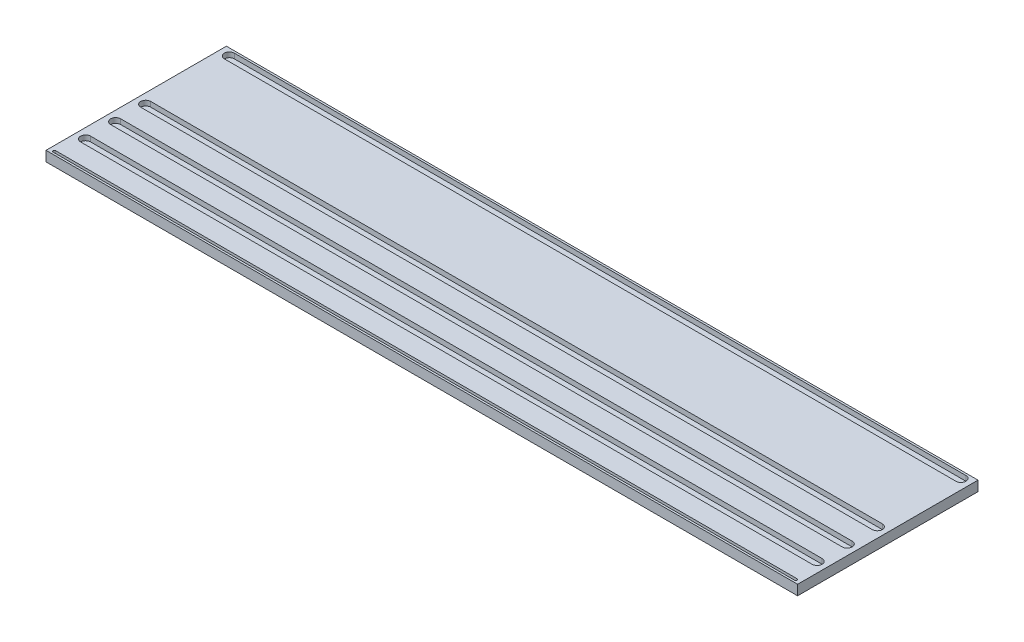
ISO-10303-21;
HEADER;
FILE_DESCRIPTION(('STEP AP214'),'2;1');
FILE_NAME('part.step','',(''),(''),'','','');
FILE_SCHEMA(('AUTOMOTIVE_DESIGN { 1 0 10303 214 1 1 1 1 }'));
ENDSEC;
DATA;
#1=APPLICATION_CONTEXT('core data for automotive mechanical design processes');
#2=APPLICATION_PROTOCOL_DEFINITION('international standard','automotive_design',2000,#1);
#3=PRODUCT_CONTEXT('',#1,'mechanical');
#4=PRODUCT('Part','Part','',(#3));
#5=PRODUCT_RELATED_PRODUCT_CATEGORY('part','',(#4));
#6=PRODUCT_DEFINITION_FORMATION('','',#4);
#7=PRODUCT_DEFINITION_CONTEXT('part definition',#1,'design');
#8=PRODUCT_DEFINITION('design','',#6,#7);
#9=PRODUCT_DEFINITION_SHAPE('','',#8);
#10=(LENGTH_UNIT() NAMED_UNIT(*) SI_UNIT(.MILLI.,.METRE.));
#11=(NAMED_UNIT(*) PLANE_ANGLE_UNIT() SI_UNIT($,.RADIAN.));
#12=(NAMED_UNIT(*) SI_UNIT($,.STERADIAN.) SOLID_ANGLE_UNIT());
#13=UNCERTAINTY_MEASURE_WITH_UNIT(LENGTH_MEASURE(1.E-05),#10,'distance_accuracy_value','');
#14=(GEOMETRIC_REPRESENTATION_CONTEXT(3) GLOBAL_UNCERTAINTY_ASSIGNED_CONTEXT((#13)) GLOBAL_UNIT_ASSIGNED_CONTEXT((#10,
#11,#12)) REPRESENTATION_CONTEXT('',''));
#15=CARTESIAN_POINT('',(0.,0.,0.));
#16=DIRECTION('',(0.,0.,1.));
#17=DIRECTION('',(1.,0.,0.));
#18=AXIS2_PLACEMENT_3D('',#15,#16,#17);
#19=CARTESIAN_POINT('',(0.,0.,-114.3));
#20=DIRECTION('',(0.,-1.,0.));
#21=DIRECTION('',(0.,0.,-1.));
#22=AXIS2_PLACEMENT_3D('',#19,#20,#21);
#23=PLANE('',#22);
#24=CARTESIAN_POINT('',(469.9,0.,-18.7325));
#25=DIRECTION('',(0.,1.,0.));
#26=DIRECTION('',(0.,0.,1.));
#27=AXIS2_PLACEMENT_3D('',#24,#25,#26);
#28=CIRCLE('',#27,3.175);
#29=CARTESIAN_POINT('',(469.9,0.,-21.9075));
#30=VERTEX_POINT('',#29);
#31=CARTESIAN_POINT('',(469.9,0.,-15.5575));
#32=VERTEX_POINT('',#31);
#33=EDGE_CURVE('E229',#30,#32,#28,.F.);
#34=ORIENTED_EDGE('',*,*,#33,.T.);
#35=DIRECTION('',(1.,0.,0.));
#36=VECTOR('',#35,1.);
#37=CARTESIAN_POINT('',(-142.971174919571,0.,-15.5575));
#38=LINE('',#37,#36);
#39=CARTESIAN_POINT('',(6.35000000000005,0.,-15.5575));
#40=VERTEX_POINT('',#39);
#41=EDGE_CURVE('E226',#40,#32,#38,.T.);
#42=ORIENTED_EDGE('',*,*,#41,.F.);
#43=CARTESIAN_POINT('',(6.35000000000005,0.,-18.7325));
#44=DIRECTION('',(0.,1.,0.));
#45=DIRECTION('',(0.,0.,1.));
#46=AXIS2_PLACEMENT_3D('',#43,#44,#45);
#47=CIRCLE('',#46,3.175);
#48=CARTESIAN_POINT('',(6.35000000000005,0.,-21.9075));
#49=VERTEX_POINT('',#48);
#50=EDGE_CURVE('E332',#40,#49,#47,.F.);
#51=ORIENTED_EDGE('',*,*,#50,.T.);
#52=DIRECTION('',(1.,0.,0.));
#53=VECTOR('',#52,1.);
#54=CARTESIAN_POINT('',(-142.971174919571,0.,-21.9075));
#55=LINE('',#54,#53);
#56=EDGE_CURVE('E508',#49,#30,#55,.T.);
#57=ORIENTED_EDGE('',*,*,#56,.T.);
#58=EDGE_LOOP('',(#34,#42,#51,#57));
#59=FACE_BOUND('',#58,.T.);
#60=CARTESIAN_POINT('',(469.9,0.,-37.7825));
#61=DIRECTION('',(0.,1.,0.));
#62=DIRECTION('',(0.,0.,1.));
#63=AXIS2_PLACEMENT_3D('',#60,#61,#62);
#64=CIRCLE('',#63,3.175);
#65=CARTESIAN_POINT('',(469.9,0.,-40.9575));
#66=VERTEX_POINT('',#65);
#67=CARTESIAN_POINT('',(469.9,0.,-34.6075));
#68=VERTEX_POINT('',#67);
#69=EDGE_CURVE('E253',#66,#68,#64,.F.);
#70=ORIENTED_EDGE('',*,*,#69,.T.);
#71=DIRECTION('',(1.,0.,0.));
#72=VECTOR('',#71,1.);
#73=CARTESIAN_POINT('',(-142.971174919571,0.,-34.6075));
#74=LINE('',#73,#72);
#75=CARTESIAN_POINT('',(6.34999999999999,0.,-34.6075));
#76=VERTEX_POINT('',#75);
#77=EDGE_CURVE('E50',#76,#68,#74,.T.);
#78=ORIENTED_EDGE('',*,*,#77,.F.);
#79=CARTESIAN_POINT('',(6.34999999999999,0.,-37.7825));
#80=DIRECTION('',(0.,1.,0.));
#81=DIRECTION('',(0.,0.,1.));
#82=AXIS2_PLACEMENT_3D('',#79,#80,#81);
#83=CIRCLE('',#82,3.175);
#84=CARTESIAN_POINT('',(6.34999999999999,0.,-40.9575));
#85=VERTEX_POINT('',#84);
#86=EDGE_CURVE('E245',#76,#85,#83,.F.);
#87=ORIENTED_EDGE('',*,*,#86,.T.);
#88=DIRECTION('',(1.,0.,0.));
#89=VECTOR('',#88,1.);
#90=CARTESIAN_POINT('',(-142.971174919571,0.,-40.9575));
#91=LINE('',#90,#89);
#92=EDGE_CURVE('E256',#85,#66,#91,.T.);
#93=ORIENTED_EDGE('',*,*,#92,.T.);
#94=EDGE_LOOP('',(#70,#78,#87,#93));
#95=FACE_BOUND('',#94,.T.);
#96=CARTESIAN_POINT('',(469.9,0.,-56.8325));
#97=DIRECTION('',(0.,1.,0.));
#98=DIRECTION('',(0.,0.,1.));
#99=AXIS2_PLACEMENT_3D('',#96,#97,#98);
#100=CIRCLE('',#99,3.175);
#101=CARTESIAN_POINT('',(469.9,0.,-60.0075));
#102=VERTEX_POINT('',#101);
#103=CARTESIAN_POINT('',(469.9,0.,-53.6575));
#104=VERTEX_POINT('',#103);
#105=EDGE_CURVE('E280',#102,#104,#100,.F.);
#106=ORIENTED_EDGE('',*,*,#105,.T.);
#107=DIRECTION('',(1.,0.,0.));
#108=VECTOR('',#107,1.);
#109=CARTESIAN_POINT('',(-142.971174919571,0.,-53.6575));
#110=LINE('',#109,#108);
#111=CARTESIAN_POINT('',(6.34999999999994,0.,-53.6575));
#112=VERTEX_POINT('',#111);
#113=EDGE_CURVE('E58',#112,#104,#110,.T.);
#114=ORIENTED_EDGE('',*,*,#113,.F.);
#115=CARTESIAN_POINT('',(6.34999999999994,0.,-56.8325));
#116=DIRECTION('',(0.,1.,0.));
#117=DIRECTION('',(0.,0.,1.));
#118=AXIS2_PLACEMENT_3D('',#115,#116,#117);
#119=CIRCLE('',#118,3.175);
#120=CARTESIAN_POINT('',(6.34999999999994,0.,-60.0075));
#121=VERTEX_POINT('',#120);
#122=EDGE_CURVE('E272',#112,#121,#119,.F.);
#123=ORIENTED_EDGE('',*,*,#122,.T.);
#124=DIRECTION('',(1.,0.,0.));
#125=VECTOR('',#124,1.);
#126=CARTESIAN_POINT('',(-142.971174919571,0.,-60.0075));
#127=LINE('',#126,#125);
#128=EDGE_CURVE('E283',#121,#102,#127,.T.);
#129=ORIENTED_EDGE('',*,*,#128,.T.);
#130=EDGE_LOOP('',(#106,#114,#123,#129));
#131=FACE_BOUND('',#130,.T.);
#132=CARTESIAN_POINT('',(469.9,0.,-109.855));
#133=DIRECTION('',(0.,1.,0.));
#134=DIRECTION('',(0.,0.,1.));
#135=AXIS2_PLACEMENT_3D('',#132,#133,#134);
#136=CIRCLE('',#135,3.175);
#137=CARTESIAN_POINT('',(469.9,0.,-106.68));
#138=VERTEX_POINT('',#137);
#139=CARTESIAN_POINT('',(469.9,0.,-113.03));
#140=VERTEX_POINT('',#139);
#141=EDGE_CURVE('E309',#138,#140,#136,.T.);
#142=ORIENTED_EDGE('',*,*,#141,.F.);
#143=DIRECTION('',(1.,0.,0.));
#144=VECTOR('',#143,1.);
#145=CARTESIAN_POINT('',(-142.971174919571,0.,-106.68));
#146=LINE('',#145,#144);
#147=CARTESIAN_POINT('',(6.35000000000002,0.,-106.68));
#148=VERTEX_POINT('',#147);
#149=EDGE_CURVE('E290',#148,#138,#146,.T.);
#150=ORIENTED_EDGE('',*,*,#149,.F.);
#151=CARTESIAN_POINT('',(6.35000000000002,0.,-109.855));
#152=DIRECTION('',(0.,1.,0.));
#153=DIRECTION('',(0.,0.,1.));
#154=AXIS2_PLACEMENT_3D('',#151,#152,#153);
#155=CIRCLE('',#154,3.175);
#156=CARTESIAN_POINT('',(6.35000000000002,0.,-113.03));
#157=VERTEX_POINT('',#156);
#158=EDGE_CURVE('E300',#148,#157,#155,.F.);
#159=ORIENTED_EDGE('',*,*,#158,.T.);
#160=DIRECTION('',(1.,0.,0.));
#161=VECTOR('',#160,1.);
#162=CARTESIAN_POINT('',(-142.971174919571,0.,-113.03));
#163=LINE('',#162,#161);
#164=EDGE_CURVE('E312',#157,#140,#163,.T.);
#165=ORIENTED_EDGE('',*,*,#164,.T.);
#166=EDGE_LOOP('',(#142,#150,#159,#165));
#167=FACE_BOUND('',#166,.T.);
#168=DIRECTION('',(0.,0.,1.));
#169=VECTOR('',#168,1.);
#170=CARTESIAN_POINT('',(0.,0.,0.));
#171=LINE('',#170,#169);
#172=CARTESIAN_POINT('',(0.,0.,-114.3));
#173=VERTEX_POINT('',#172);
#174=CARTESIAN_POINT('',(0.,0.,0.));
#175=VERTEX_POINT('',#174);
#176=EDGE_CURVE('E343',#173,#175,#171,.T.);
#177=ORIENTED_EDGE('',*,*,#176,.T.);
#178=DIRECTION('',(1.,0.,0.));
#179=VECTOR('',#178,1.);
#180=CARTESIAN_POINT('',(0.,0.,0.));
#181=LINE('',#180,#179);
#182=CARTESIAN_POINT('',(476.25,0.,0.));
#183=VERTEX_POINT('',#182);
#184=EDGE_CURVE('E360',#175,#183,#181,.T.);
#185=ORIENTED_EDGE('',*,*,#184,.T.);
#186=DIRECTION('',(0.,0.,-1.));
#187=VECTOR('',#186,1.);
#188=CARTESIAN_POINT('',(476.25,0.,0.));
#189=LINE('',#188,#187);
#190=CARTESIAN_POINT('',(476.25,0.,-114.3));
#191=VERTEX_POINT('',#190);
#192=EDGE_CURVE('E363',#183,#191,#189,.T.);
#193=ORIENTED_EDGE('',*,*,#192,.T.);
#194=DIRECTION('',(-1.,0.,0.));
#195=VECTOR('',#194,1.);
#196=CARTESIAN_POINT('',(0.,0.,-114.3));
#197=LINE('',#196,#195);
#198=EDGE_CURVE('E349',#191,#173,#197,.T.);
#199=ORIENTED_EDGE('',*,*,#198,.T.);
#200=EDGE_LOOP('',(#177,#185,#193,#199));
#201=FACE_BOUND('',#200,.T.);
#202=CARTESIAN_POINT('',(473.075,0.,-2.06375));
#203=DIRECTION('',(0.,1.,0.));
#204=DIRECTION('',(0.,0.,1.));
#205=AXIS2_PLACEMENT_3D('',#202,#203,#204);
#206=CIRCLE('',#205,0.79375);
#207=CARTESIAN_POINT('',(473.075,0.,-2.8575));
#208=VERTEX_POINT('',#207);
#209=CARTESIAN_POINT('',(473.075,0.,-1.27000000000001));
#210=VERTEX_POINT('',#209);
#211=EDGE_CURVE('E217',#208,#210,#206,.F.);
#212=ORIENTED_EDGE('',*,*,#211,.T.);
#213=DIRECTION('',(1.,0.,0.));
#214=VECTOR('',#213,1.);
#215=CARTESIAN_POINT('',(-142.971174919571,0.,-1.26999999999999));
#216=LINE('',#215,#214);
#217=CARTESIAN_POINT('',(3.17500000000001,0.,-1.26999999999999));
#218=VERTEX_POINT('',#217);
#219=EDGE_CURVE('E208',#218,#210,#216,.T.);
#220=ORIENTED_EDGE('',*,*,#219,.F.);
#221=CARTESIAN_POINT('',(3.17500000000001,0.,-2.06375));
#222=DIRECTION('',(0.,1.,0.));
#223=DIRECTION('',(0.,0.,1.));
#224=AXIS2_PLACEMENT_3D('',#221,#222,#223);
#225=CIRCLE('',#224,0.79375);
#226=CARTESIAN_POINT('',(3.17500000000001,0.,-2.8575));
#227=VERTEX_POINT('',#226);
#228=EDGE_CURVE('E319',#218,#227,#225,.F.);
#229=ORIENTED_EDGE('',*,*,#228,.T.);
#230=DIRECTION('',(1.,0.,0.));
#231=VECTOR('',#230,1.);
#232=CARTESIAN_POINT('',(-142.971174919571,0.,-2.8575));
#233=LINE('',#232,#231);
#234=EDGE_CURVE('E501',#227,#208,#233,.T.);
#235=ORIENTED_EDGE('',*,*,#234,.T.);
#236=EDGE_LOOP('',(#212,#220,#229,#235));
#237=FACE_BOUND('',#236,.T.);
#238=ADVANCED_FACE('F33',(#59,#95,#131,#167,#201,#237),#23,.F.);
#239=CARTESIAN_POINT('',(0.,-6.35,0.));
#240=DIRECTION('',(-1.,0.,0.));
#241=DIRECTION('',(0.,0.,1.));
#242=AXIS2_PLACEMENT_3D('',#239,#240,#241);
#243=PLANE('',#242);
#244=ORIENTED_EDGE('',*,*,#176,.F.);
#245=DIRECTION('',(0.,1.,0.));
#246=VECTOR('',#245,1.);
#247=CARTESIAN_POINT('',(0.,-6.35,-114.3));
#248=LINE('',#247,#246);
#249=CARTESIAN_POINT('',(0.,-6.35,-114.3));
#250=VERTEX_POINT('',#249);
#251=EDGE_CURVE('E11',#250,#173,#248,.T.);
#252=ORIENTED_EDGE('',*,*,#251,.F.);
#253=DIRECTION('',(0.,0.,1.));
#254=VECTOR('',#253,1.);
#255=CARTESIAN_POINT('',(0.,-6.35,0.));
#256=LINE('',#255,#254);
#257=CARTESIAN_POINT('',(0.,-6.35,0.));
#258=VERTEX_POINT('',#257);
#259=EDGE_CURVE('E345',#250,#258,#256,.T.);
#260=ORIENTED_EDGE('',*,*,#259,.T.);
#261=DIRECTION('',(0.,1.,0.));
#262=VECTOR('',#261,1.);
#263=CARTESIAN_POINT('',(0.,-6.35,0.));
#264=LINE('',#263,#262);
#265=EDGE_CURVE('E37',#258,#175,#264,.T.);
#266=ORIENTED_EDGE('',*,*,#265,.T.);
#267=EDGE_LOOP('',(#244,#252,#260,#266));
#268=FACE_BOUND('',#267,.T.);
#269=ADVANCED_FACE('F35',(#268),#243,.T.);
#270=CARTESIAN_POINT('',(0.,-6.35,-114.3));
#271=DIRECTION('',(0.,0.,-1.));
#272=DIRECTION('',(-1.,0.,0.));
#273=AXIS2_PLACEMENT_3D('',#270,#271,#272);
#274=PLANE('',#273);
#275=ORIENTED_EDGE('',*,*,#198,.F.);
#276=DIRECTION('',(0.,1.,0.));
#277=VECTOR('',#276,1.);
#278=CARTESIAN_POINT('',(476.25,-6.35,-114.3));
#279=LINE('',#278,#277);
#280=CARTESIAN_POINT('',(476.25,-6.35,-114.3));
#281=VERTEX_POINT('',#280);
#282=EDGE_CURVE('E42',#281,#191,#279,.T.);
#283=ORIENTED_EDGE('',*,*,#282,.F.);
#284=DIRECTION('',(-1.,0.,0.));
#285=VECTOR('',#284,1.);
#286=CARTESIAN_POINT('',(0.,-6.35,-114.3));
#287=LINE('',#286,#285);
#288=EDGE_CURVE('E355',#281,#250,#287,.T.);
#289=ORIENTED_EDGE('',*,*,#288,.T.);
#290=ORIENTED_EDGE('',*,*,#251,.T.);
#291=EDGE_LOOP('',(#275,#283,#289,#290));
#292=FACE_BOUND('',#291,.T.);
#293=ADVANCED_FACE('F381',(#292),#274,.T.);
#294=CARTESIAN_POINT('',(476.25,-6.35,0.));
#295=DIRECTION('',(1.,0.,0.));
#296=DIRECTION('',(0.,0.,-1.));
#297=AXIS2_PLACEMENT_3D('',#294,#295,#296);
#298=PLANE('',#297);
#299=ORIENTED_EDGE('',*,*,#192,.F.);
#300=DIRECTION('',(0.,1.,0.));
#301=VECTOR('',#300,1.);
#302=CARTESIAN_POINT('',(476.25,-6.35,0.));
#303=LINE('',#302,#301);
#304=CARTESIAN_POINT('',(476.25,-6.35,0.));
#305=VERTEX_POINT('',#304);
#306=EDGE_CURVE('E368',#305,#183,#303,.T.);
#307=ORIENTED_EDGE('',*,*,#306,.F.);
#308=DIRECTION('',(0.,0.,-1.));
#309=VECTOR('',#308,1.);
#310=CARTESIAN_POINT('',(476.25,-6.35,0.));
#311=LINE('',#310,#309);
#312=EDGE_CURVE('E352',#305,#281,#311,.T.);
#313=ORIENTED_EDGE('',*,*,#312,.T.);
#314=ORIENTED_EDGE('',*,*,#282,.T.);
#315=EDGE_LOOP('',(#299,#307,#313,#314));
#316=FACE_BOUND('',#315,.T.);
#317=ADVANCED_FACE('F387',(#316),#298,.T.);
#318=CARTESIAN_POINT('',(0.,-6.35,0.));
#319=DIRECTION('',(0.,0.,1.));
#320=DIRECTION('',(1.,0.,0.));
#321=AXIS2_PLACEMENT_3D('',#318,#319,#320);
#322=PLANE('',#321);
#323=ORIENTED_EDGE('',*,*,#184,.F.);
#324=ORIENTED_EDGE('',*,*,#265,.F.);
#325=DIRECTION('',(1.,0.,0.));
#326=VECTOR('',#325,1.);
#327=CARTESIAN_POINT('',(0.,-6.35,0.));
#328=LINE('',#327,#326);
#329=EDGE_CURVE('E348',#258,#305,#328,.T.);
#330=ORIENTED_EDGE('',*,*,#329,.T.);
#331=ORIENTED_EDGE('',*,*,#306,.T.);
#332=EDGE_LOOP('',(#323,#324,#330,#331));
#333=FACE_BOUND('',#332,.T.);
#334=ADVANCED_FACE('F376',(#333),#322,.T.);
#335=CARTESIAN_POINT('',(0.,-6.35,-114.3));
#336=DIRECTION('',(0.,-1.,0.));
#337=DIRECTION('',(0.,0.,-1.));
#338=AXIS2_PLACEMENT_3D('',#335,#336,#337);
#339=PLANE('',#338);
#340=ORIENTED_EDGE('',*,*,#259,.F.);
#341=ORIENTED_EDGE('',*,*,#288,.F.);
#342=ORIENTED_EDGE('',*,*,#312,.F.);
#343=ORIENTED_EDGE('',*,*,#329,.F.);
#344=EDGE_LOOP('',(#340,#341,#342,#343));
#345=FACE_BOUND('',#344,.T.);
#346=ADVANCED_FACE('F384',(#345),#339,.T.);
#347=CARTESIAN_POINT('',(6.35000000000005,-3.175,-18.7325));
#348=DIRECTION('',(0.,1.,0.));
#349=DIRECTION('',(0.,0.,1.));
#350=AXIS2_PLACEMENT_3D('',#347,#348,#349);
#351=CYLINDRICAL_SURFACE('',#350,3.175);
#352=ORIENTED_EDGE('',*,*,#50,.F.);
#353=DIRECTION('',(0.,1.,0.));
#354=VECTOR('',#353,1.);
#355=CARTESIAN_POINT('',(6.35000000000005,-3.175,-15.5575));
#356=LINE('',#355,#354);
#357=CARTESIAN_POINT('',(6.35000000000005,-3.175,-15.5575));
#358=VERTEX_POINT('',#357);
#359=EDGE_CURVE('E337',#358,#40,#356,.T.);
#360=ORIENTED_EDGE('',*,*,#359,.F.);
#361=CARTESIAN_POINT('',(6.35000000000005,-3.175,-18.7325));
#362=DIRECTION('',(0.,1.,0.));
#363=DIRECTION('',(0.,0.,1.));
#364=AXIS2_PLACEMENT_3D('',#361,#362,#363);
#365=CIRCLE('',#364,3.175);
#366=CARTESIAN_POINT('',(6.35000000000005,-3.175,-21.9075));
#367=VERTEX_POINT('',#366);
#368=EDGE_CURVE('E334',#358,#367,#365,.F.);
#369=ORIENTED_EDGE('',*,*,#368,.T.);
#370=DIRECTION('',(0.,1.,0.));
#371=VECTOR('',#370,1.);
#372=CARTESIAN_POINT('',(6.35000000000005,-3.175,-21.9075));
#373=LINE('',#372,#371);
#374=EDGE_CURVE('E340',#367,#49,#373,.T.);
#375=ORIENTED_EDGE('',*,*,#374,.T.);
#376=EDGE_LOOP('',(#352,#360,#369,#375));
#377=FACE_BOUND('',#376,.T.);
#378=ADVANCED_FACE('F405',(#377),#351,.F.);
#379=CARTESIAN_POINT('',(-142.971174919571,-3.175,-57.15));
#380=DIRECTION('',(0.,1.,0.));
#381=DIRECTION('',(0.,0.,1.));
#382=AXIS2_PLACEMENT_3D('',#379,#380,#381);
#383=PLANE('',#382);
#384=ORIENTED_EDGE('',*,*,#368,.F.);
#385=DIRECTION('',(1.,0.,0.));
#386=VECTOR('',#385,1.);
#387=CARTESIAN_POINT('',(-142.971174919571,-3.175,-15.5575));
#388=LINE('',#387,#386);
#389=CARTESIAN_POINT('',(469.9,-3.175,-15.5575));
#390=VERTEX_POINT('',#389);
#391=EDGE_CURVE('E223',#358,#390,#388,.T.);
#392=ORIENTED_EDGE('',*,*,#391,.T.);
#393=CARTESIAN_POINT('',(469.9,-3.175,-18.7325));
#394=DIRECTION('',(0.,1.,0.));
#395=DIRECTION('',(0.,0.,1.));
#396=AXIS2_PLACEMENT_3D('',#393,#394,#395);
#397=CIRCLE('',#396,3.175);
#398=CARTESIAN_POINT('',(469.9,-3.175,-21.9075));
#399=VERTEX_POINT('',#398);
#400=EDGE_CURVE('E231',#399,#390,#397,.F.);
#401=ORIENTED_EDGE('',*,*,#400,.F.);
#402=DIRECTION('',(1.,0.,0.));
#403=VECTOR('',#402,1.);
#404=CARTESIAN_POINT('',(-142.971174919571,-3.175,-21.9075));
#405=LINE('',#404,#403);
#406=EDGE_CURVE('E506',#367,#399,#405,.T.);
#407=ORIENTED_EDGE('',*,*,#406,.F.);
#408=EDGE_LOOP('',(#384,#392,#401,#407));
#409=FACE_BOUND('',#408,.T.);
#410=ADVANCED_FACE('F408',(#409),#383,.T.);
#411=CARTESIAN_POINT('',(3.17500000000001,-3.175,-2.06375));
#412=DIRECTION('',(0.,1.,0.));
#413=DIRECTION('',(0.,0.,1.));
#414=AXIS2_PLACEMENT_3D('',#411,#412,#413);
#415=CYLINDRICAL_SURFACE('',#414,0.79375);
#416=ORIENTED_EDGE('',*,*,#228,.F.);
#417=DIRECTION('',(0.,1.,0.));
#418=VECTOR('',#417,1.);
#419=CARTESIAN_POINT('',(3.17500000000001,-3.175,-1.26999999999999));
#420=LINE('',#419,#418);
#421=CARTESIAN_POINT('',(3.17500000000001,-3.175,-1.26999999999999));
#422=VERTEX_POINT('',#421);
#423=EDGE_CURVE('E328',#422,#218,#420,.T.);
#424=ORIENTED_EDGE('',*,*,#423,.F.);
#425=CARTESIAN_POINT('',(3.17500000000001,-3.175,-2.06375));
#426=DIRECTION('',(0.,1.,0.));
#427=DIRECTION('',(0.,0.,1.));
#428=AXIS2_PLACEMENT_3D('',#425,#426,#427);
#429=CIRCLE('',#428,0.79375);
#430=CARTESIAN_POINT('',(3.17500000000001,-3.175,-2.8575));
#431=VERTEX_POINT('',#430);
#432=EDGE_CURVE('E326',#422,#431,#429,.F.);
#433=ORIENTED_EDGE('',*,*,#432,.T.);
#434=DIRECTION('',(0.,1.,0.));
#435=VECTOR('',#434,1.);
#436=CARTESIAN_POINT('',(3.17500000000001,-3.175,-2.8575));
#437=LINE('',#436,#435);
#438=EDGE_CURVE('E202',#431,#227,#437,.T.);
#439=ORIENTED_EDGE('',*,*,#438,.T.);
#440=EDGE_LOOP('',(#416,#424,#433,#439));
#441=FACE_BOUND('',#440,.T.);
#442=ADVANCED_FACE('F412',(#441),#415,.F.);
#443=CARTESIAN_POINT('',(-142.971174919571,-3.175,-57.15));
#444=DIRECTION('',(0.,1.,0.));
#445=DIRECTION('',(0.,0.,1.));
#446=AXIS2_PLACEMENT_3D('',#443,#444,#445);
#447=PLANE('',#446);
#448=ORIENTED_EDGE('',*,*,#432,.F.);
#449=DIRECTION('',(1.,0.,0.));
#450=VECTOR('',#449,1.);
#451=CARTESIAN_POINT('',(-142.971174919571,-3.175,-1.26999999999999));
#452=LINE('',#451,#450);
#453=CARTESIAN_POINT('',(473.075,-3.175,-1.27000000000001));
#454=VERTEX_POINT('',#453);
#455=EDGE_CURVE('E207',#422,#454,#452,.T.);
#456=ORIENTED_EDGE('',*,*,#455,.T.);
#457=CARTESIAN_POINT('',(473.075,-3.175,-2.06375));
#458=DIRECTION('',(0.,1.,0.));
#459=DIRECTION('',(0.,0.,1.));
#460=AXIS2_PLACEMENT_3D('',#457,#458,#459);
#461=CIRCLE('',#460,0.79375);
#462=CARTESIAN_POINT('',(473.075,-3.175,-2.8575));
#463=VERTEX_POINT('',#462);
#464=EDGE_CURVE('E215',#463,#454,#461,.F.);
#465=ORIENTED_EDGE('',*,*,#464,.F.);
#466=DIRECTION('',(1.,0.,0.));
#467=VECTOR('',#466,1.);
#468=CARTESIAN_POINT('',(-142.971174919571,-3.175,-2.8575));
#469=LINE('',#468,#467);
#470=EDGE_CURVE('E196',#431,#463,#469,.T.);
#471=ORIENTED_EDGE('',*,*,#470,.F.);
#472=EDGE_LOOP('',(#448,#456,#465,#471));
#473=FACE_BOUND('',#472,.T.);
#474=ADVANCED_FACE('F220',(#473),#447,.T.);
#475=CARTESIAN_POINT('',(-142.971174919571,-3.175,-106.68));
#476=DIRECTION('',(0.,0.,1.));
#477=DIRECTION('',(1.,0.,0.));
#478=AXIS2_PLACEMENT_3D('',#475,#476,#477);
#479=PLANE('',#478);
#480=ORIENTED_EDGE('',*,*,#149,.T.);
#481=DIRECTION('',(0.,1.,0.));
#482=VECTOR('',#481,1.);
#483=CARTESIAN_POINT('',(469.9,-3.175,-106.68));
#484=LINE('',#483,#482);
#485=CARTESIAN_POINT('',(469.9,-3.175,-106.68));
#486=VERTEX_POINT('',#485);
#487=EDGE_CURVE('E307',#486,#138,#484,.T.);
#488=ORIENTED_EDGE('',*,*,#487,.F.);
#489=DIRECTION('',(1.,0.,0.));
#490=VECTOR('',#489,1.);
#491=CARTESIAN_POINT('',(-142.971174919571,-3.175,-106.68));
#492=LINE('',#491,#490);
#493=CARTESIAN_POINT('',(6.35000000000002,-3.175,-106.68));
#494=VERTEX_POINT('',#493);
#495=EDGE_CURVE('E296',#494,#486,#492,.T.);
#496=ORIENTED_EDGE('',*,*,#495,.F.);
#497=DIRECTION('',(0.,1.,0.));
#498=VECTOR('',#497,1.);
#499=CARTESIAN_POINT('',(6.35000000000002,-3.175,-106.68));
#500=LINE('',#499,#498);
#501=EDGE_CURVE('E317',#494,#148,#500,.T.);
#502=ORIENTED_EDGE('',*,*,#501,.T.);
#503=EDGE_LOOP('',(#480,#488,#496,#502));
#504=FACE_BOUND('',#503,.T.);
#505=ADVANCED_FACE('F419',(#504),#479,.F.);
#506=CARTESIAN_POINT('',(6.35000000000002,-3.175,-109.855));
#507=DIRECTION('',(0.,1.,0.));
#508=DIRECTION('',(0.,0.,1.));
#509=AXIS2_PLACEMENT_3D('',#506,#507,#508);
#510=CYLINDRICAL_SURFACE('',#509,3.175);
#511=ORIENTED_EDGE('',*,*,#158,.F.);
#512=ORIENTED_EDGE('',*,*,#501,.F.);
#513=CARTESIAN_POINT('',(6.35000000000002,-3.175,-109.855));
#514=DIRECTION('',(0.,1.,0.));
#515=DIRECTION('',(0.,0.,1.));
#516=AXIS2_PLACEMENT_3D('',#513,#514,#515);
#517=CIRCLE('',#516,3.175);
#518=CARTESIAN_POINT('',(6.35000000000002,-3.175,-113.03));
#519=VERTEX_POINT('',#518);
#520=EDGE_CURVE('E305',#494,#519,#517,.F.);
#521=ORIENTED_EDGE('',*,*,#520,.T.);
#522=DIRECTION('',(0.,1.,0.));
#523=VECTOR('',#522,1.);
#524=CARTESIAN_POINT('',(6.35000000000002,-3.175,-113.03));
#525=LINE('',#524,#523);
#526=EDGE_CURVE('E320',#519,#157,#525,.T.);
#527=ORIENTED_EDGE('',*,*,#526,.T.);
#528=EDGE_LOOP('',(#511,#512,#521,#527));
#529=FACE_BOUND('',#528,.T.);
#530=ADVANCED_FACE('F422',(#529),#510,.F.);
#531=CARTESIAN_POINT('',(-142.971174919571,-3.175,-113.03));
#532=DIRECTION('',(0.,0.,1.));
#533=DIRECTION('',(1.,0.,0.));
#534=AXIS2_PLACEMENT_3D('',#531,#532,#533);
#535=PLANE('',#534);
#536=ORIENTED_EDGE('',*,*,#164,.F.);
#537=ORIENTED_EDGE('',*,*,#526,.F.);
#538=DIRECTION('',(1.,0.,0.));
#539=VECTOR('',#538,1.);
#540=CARTESIAN_POINT('',(-142.971174919571,-3.175,-113.03));
#541=LINE('',#540,#539);
#542=CARTESIAN_POINT('',(469.9,-3.175,-113.03));
#543=VERTEX_POINT('',#542);
#544=EDGE_CURVE('E303',#519,#543,#541,.T.);
#545=ORIENTED_EDGE('',*,*,#544,.T.);
#546=DIRECTION('',(0.,1.,0.));
#547=VECTOR('',#546,1.);
#548=CARTESIAN_POINT('',(469.9,-3.175,-113.03));
#549=LINE('',#548,#547);
#550=EDGE_CURVE('E322',#543,#140,#549,.T.);
#551=ORIENTED_EDGE('',*,*,#550,.T.);
#552=EDGE_LOOP('',(#536,#537,#545,#551));
#553=FACE_BOUND('',#552,.T.);
#554=ADVANCED_FACE('F428',(#553),#535,.T.);
#555=CARTESIAN_POINT('',(469.9,-3.175,-109.855));
#556=DIRECTION('',(0.,1.,0.));
#557=DIRECTION('',(0.,0.,1.));
#558=AXIS2_PLACEMENT_3D('',#555,#556,#557);
#559=CYLINDRICAL_SURFACE('',#558,3.175);
#560=ORIENTED_EDGE('',*,*,#141,.T.);
#561=ORIENTED_EDGE('',*,*,#550,.F.);
#562=CARTESIAN_POINT('',(469.9,-3.175,-109.855));
#563=DIRECTION('',(0.,1.,0.));
#564=DIRECTION('',(0.,0.,1.));
#565=AXIS2_PLACEMENT_3D('',#562,#563,#564);
#566=CIRCLE('',#565,3.175);
#567=EDGE_CURVE('E299',#486,#543,#566,.T.);
#568=ORIENTED_EDGE('',*,*,#567,.F.);
#569=ORIENTED_EDGE('',*,*,#487,.T.);
#570=EDGE_LOOP('',(#560,#561,#568,#569));
#571=FACE_BOUND('',#570,.T.);
#572=ADVANCED_FACE('F424',(#571),#559,.F.);
#573=CARTESIAN_POINT('',(-142.971174919571,-3.175,-57.15));
#574=DIRECTION('',(0.,1.,0.));
#575=DIRECTION('',(0.,0.,1.));
#576=AXIS2_PLACEMENT_3D('',#573,#574,#575);
#577=PLANE('',#576);
#578=ORIENTED_EDGE('',*,*,#495,.T.);
#579=ORIENTED_EDGE('',*,*,#567,.T.);
#580=ORIENTED_EDGE('',*,*,#544,.F.);
#581=ORIENTED_EDGE('',*,*,#520,.F.);
#582=EDGE_LOOP('',(#578,#579,#580,#581));
#583=FACE_BOUND('',#582,.T.);
#584=ADVANCED_FACE('F427',(#583),#577,.T.);
#585=CARTESIAN_POINT('',(-142.971174919571,-3.175,-53.6575));
#586=DIRECTION('',(0.,0.,1.));
#587=DIRECTION('',(1.,0.,0.));
#588=AXIS2_PLACEMENT_3D('',#585,#586,#587);
#589=PLANE('',#588);
#590=ORIENTED_EDGE('',*,*,#113,.T.);
#591=DIRECTION('',(0.,1.,0.));
#592=VECTOR('',#591,1.);
#593=CARTESIAN_POINT('',(469.9,-3.175,-53.6575));
#594=LINE('',#593,#592);
#595=CARTESIAN_POINT('',(469.9,-3.175,-53.6575));
#596=VERTEX_POINT('',#595);
#597=EDGE_CURVE('E278',#596,#104,#594,.T.);
#598=ORIENTED_EDGE('',*,*,#597,.F.);
#599=DIRECTION('',(1.,0.,0.));
#600=VECTOR('',#599,1.);
#601=CARTESIAN_POINT('',(-142.971174919571,-3.175,-53.6575));
#602=LINE('',#601,#600);
#603=CARTESIAN_POINT('',(6.34999999999994,-3.175,-53.6575));
#604=VERTEX_POINT('',#603);
#605=EDGE_CURVE('E268',#604,#596,#602,.T.);
#606=ORIENTED_EDGE('',*,*,#605,.F.);
#607=DIRECTION('',(0.,1.,0.));
#608=VECTOR('',#607,1.);
#609=CARTESIAN_POINT('',(6.34999999999994,-3.175,-53.6575));
#610=LINE('',#609,#608);
#611=EDGE_CURVE('E288',#604,#112,#610,.T.);
#612=ORIENTED_EDGE('',*,*,#611,.T.);
#613=EDGE_LOOP('',(#590,#598,#606,#612));
#614=FACE_BOUND('',#613,.T.);
#615=ADVANCED_FACE('F438',(#614),#589,.F.);
#616=CARTESIAN_POINT('',(6.34999999999994,-3.175,-56.8325));
#617=DIRECTION('',(0.,1.,0.));
#618=DIRECTION('',(0.,0.,1.));
#619=AXIS2_PLACEMENT_3D('',#616,#617,#618);
#620=CYLINDRICAL_SURFACE('',#619,3.175);
#621=ORIENTED_EDGE('',*,*,#122,.F.);
#622=ORIENTED_EDGE('',*,*,#611,.F.);
#623=CARTESIAN_POINT('',(6.34999999999994,-3.175,-56.8325));
#624=DIRECTION('',(0.,1.,0.));
#625=DIRECTION('',(0.,0.,1.));
#626=AXIS2_PLACEMENT_3D('',#623,#624,#625);
#627=CIRCLE('',#626,3.175);
#628=CARTESIAN_POINT('',(6.34999999999994,-3.175,-60.0075));
#629=VERTEX_POINT('',#628);
#630=EDGE_CURVE('E276',#604,#629,#627,.F.);
#631=ORIENTED_EDGE('',*,*,#630,.T.);
#632=DIRECTION('',(0.,1.,0.));
#633=VECTOR('',#632,1.);
#634=CARTESIAN_POINT('',(6.34999999999994,-3.175,-60.0075));
#635=LINE('',#634,#633);
#636=EDGE_CURVE('E291',#629,#121,#635,.T.);
#637=ORIENTED_EDGE('',*,*,#636,.T.);
#638=EDGE_LOOP('',(#621,#622,#631,#637));
#639=FACE_BOUND('',#638,.T.);
#640=ADVANCED_FACE('F442',(#639),#620,.F.);
#641=CARTESIAN_POINT('',(-142.971174919571,-3.175,-60.0075));
#642=DIRECTION('',(0.,0.,1.));
#643=DIRECTION('',(1.,0.,0.));
#644=AXIS2_PLACEMENT_3D('',#641,#642,#643);
#645=PLANE('',#644);
#646=ORIENTED_EDGE('',*,*,#128,.F.);
#647=ORIENTED_EDGE('',*,*,#636,.F.);
#648=DIRECTION('',(1.,0.,0.));
#649=VECTOR('',#648,1.);
#650=CARTESIAN_POINT('',(-142.971174919571,-3.175,-60.0075));
#651=LINE('',#650,#649);
#652=CARTESIAN_POINT('',(469.9,-3.175,-60.0075));
#653=VERTEX_POINT('',#652);
#654=EDGE_CURVE('E274',#629,#653,#651,.T.);
#655=ORIENTED_EDGE('',*,*,#654,.T.);
#656=DIRECTION('',(0.,1.,0.));
#657=VECTOR('',#656,1.);
#658=CARTESIAN_POINT('',(469.9,-3.175,-60.0075));
#659=LINE('',#658,#657);
#660=EDGE_CURVE('E293',#653,#102,#659,.T.);
#661=ORIENTED_EDGE('',*,*,#660,.T.);
#662=EDGE_LOOP('',(#646,#647,#655,#661));
#663=FACE_BOUND('',#662,.T.);
#664=ADVANCED_FACE('F447',(#663),#645,.T.);
#665=CARTESIAN_POINT('',(469.9,-3.175,-56.8325));
#666=DIRECTION('',(0.,1.,0.));
#667=DIRECTION('',(0.,0.,1.));
#668=AXIS2_PLACEMENT_3D('',#665,#666,#667);
#669=CYLINDRICAL_SURFACE('',#668,3.175);
#670=ORIENTED_EDGE('',*,*,#105,.F.);
#671=ORIENTED_EDGE('',*,*,#660,.F.);
#672=CARTESIAN_POINT('',(469.9,-3.175,-56.8325));
#673=DIRECTION('',(0.,1.,0.));
#674=DIRECTION('',(0.,0.,1.));
#675=AXIS2_PLACEMENT_3D('',#672,#673,#674);
#676=CIRCLE('',#675,3.175);
#677=EDGE_CURVE('E271',#653,#596,#676,.F.);
#678=ORIENTED_EDGE('',*,*,#677,.T.);
#679=ORIENTED_EDGE('',*,*,#597,.T.);
#680=EDGE_LOOP('',(#670,#671,#678,#679));
#681=FACE_BOUND('',#680,.T.);
#682=ADVANCED_FACE('F443',(#681),#669,.F.);
#683=CARTESIAN_POINT('',(-142.971174919571,-3.175,-57.15));
#684=DIRECTION('',(0.,1.,0.));
#685=DIRECTION('',(0.,0.,1.));
#686=AXIS2_PLACEMENT_3D('',#683,#684,#685);
#687=PLANE('',#686);
#688=ORIENTED_EDGE('',*,*,#605,.T.);
#689=ORIENTED_EDGE('',*,*,#677,.F.);
#690=ORIENTED_EDGE('',*,*,#654,.F.);
#691=ORIENTED_EDGE('',*,*,#630,.F.);
#692=EDGE_LOOP('',(#688,#689,#690,#691));
#693=FACE_BOUND('',#692,.T.);
#694=ADVANCED_FACE('F446',(#693),#687,.T.);
#695=CARTESIAN_POINT('',(-142.971174919571,-3.175,-34.6075));
#696=DIRECTION('',(0.,0.,1.));
#697=DIRECTION('',(1.,0.,0.));
#698=AXIS2_PLACEMENT_3D('',#695,#696,#697);
#699=PLANE('',#698);
#700=ORIENTED_EDGE('',*,*,#77,.T.);
#701=DIRECTION('',(0.,1.,0.));
#702=VECTOR('',#701,1.);
#703=CARTESIAN_POINT('',(469.9,-3.175,-34.6075));
#704=LINE('',#703,#702);
#705=CARTESIAN_POINT('',(469.9,-3.175,-34.6075));
#706=VERTEX_POINT('',#705);
#707=EDGE_CURVE('E251',#706,#68,#704,.T.);
#708=ORIENTED_EDGE('',*,*,#707,.F.);
#709=DIRECTION('',(1.,0.,0.));
#710=VECTOR('',#709,1.);
#711=CARTESIAN_POINT('',(-142.971174919571,-3.175,-34.6075));
#712=LINE('',#711,#710);
#713=CARTESIAN_POINT('',(6.34999999999999,-3.175,-34.6075));
#714=VERTEX_POINT('',#713);
#715=EDGE_CURVE('E241',#714,#706,#712,.T.);
#716=ORIENTED_EDGE('',*,*,#715,.F.);
#717=DIRECTION('',(0.,1.,0.));
#718=VECTOR('',#717,1.);
#719=CARTESIAN_POINT('',(6.34999999999999,-3.175,-34.6075));
#720=LINE('',#719,#718);
#721=EDGE_CURVE('E261',#714,#76,#720,.T.);
#722=ORIENTED_EDGE('',*,*,#721,.T.);
#723=EDGE_LOOP('',(#700,#708,#716,#722));
#724=FACE_BOUND('',#723,.T.);
#725=ADVANCED_FACE('F457',(#724),#699,.F.);
#726=CARTESIAN_POINT('',(6.34999999999999,-3.175,-37.7825));
#727=DIRECTION('',(0.,1.,0.));
#728=DIRECTION('',(0.,0.,1.));
#729=AXIS2_PLACEMENT_3D('',#726,#727,#728);
#730=CYLINDRICAL_SURFACE('',#729,3.175);
#731=ORIENTED_EDGE('',*,*,#86,.F.);
#732=ORIENTED_EDGE('',*,*,#721,.F.);
#733=CARTESIAN_POINT('',(6.34999999999999,-3.175,-37.7825));
#734=DIRECTION('',(0.,1.,0.));
#735=DIRECTION('',(0.,0.,1.));
#736=AXIS2_PLACEMENT_3D('',#733,#734,#735);
#737=CIRCLE('',#736,3.175);
#738=CARTESIAN_POINT('',(6.34999999999999,-3.175,-40.9575));
#739=VERTEX_POINT('',#738);
#740=EDGE_CURVE('E249',#714,#739,#737,.F.);
#741=ORIENTED_EDGE('',*,*,#740,.T.);
#742=DIRECTION('',(0.,1.,0.));
#743=VECTOR('',#742,1.);
#744=CARTESIAN_POINT('',(6.34999999999999,-3.175,-40.9575));
#745=LINE('',#744,#743);
#746=EDGE_CURVE('E263',#739,#85,#745,.T.);
#747=ORIENTED_EDGE('',*,*,#746,.T.);
#748=EDGE_LOOP('',(#731,#732,#741,#747));
#749=FACE_BOUND('',#748,.T.);
#750=ADVANCED_FACE('F461',(#749),#730,.F.);
#751=CARTESIAN_POINT('',(-142.971174919571,-3.175,-40.9575));
#752=DIRECTION('',(0.,0.,1.));
#753=DIRECTION('',(1.,0.,0.));
#754=AXIS2_PLACEMENT_3D('',#751,#752,#753);
#755=PLANE('',#754);
#756=ORIENTED_EDGE('',*,*,#92,.F.);
#757=ORIENTED_EDGE('',*,*,#746,.F.);
#758=DIRECTION('',(1.,0.,0.));
#759=VECTOR('',#758,1.);
#760=CARTESIAN_POINT('',(-142.971174919571,-3.175,-40.9575));
#761=LINE('',#760,#759);
#762=CARTESIAN_POINT('',(469.9,-3.175,-40.9575));
#763=VERTEX_POINT('',#762);
#764=EDGE_CURVE('E247',#739,#763,#761,.T.);
#765=ORIENTED_EDGE('',*,*,#764,.T.);
#766=DIRECTION('',(0.,1.,0.));
#767=VECTOR('',#766,1.);
#768=CARTESIAN_POINT('',(469.9,-3.175,-40.9575));
#769=LINE('',#768,#767);
#770=EDGE_CURVE('E265',#763,#66,#769,.T.);
#771=ORIENTED_EDGE('',*,*,#770,.T.);
#772=EDGE_LOOP('',(#756,#757,#765,#771));
#773=FACE_BOUND('',#772,.T.);
#774=ADVANCED_FACE('F466',(#773),#755,.T.);
#775=CARTESIAN_POINT('',(469.9,-3.175,-37.7825));
#776=DIRECTION('',(0.,1.,0.));
#777=DIRECTION('',(0.,0.,1.));
#778=AXIS2_PLACEMENT_3D('',#775,#776,#777);
#779=CYLINDRICAL_SURFACE('',#778,3.175);
#780=ORIENTED_EDGE('',*,*,#69,.F.);
#781=ORIENTED_EDGE('',*,*,#770,.F.);
#782=CARTESIAN_POINT('',(469.9,-3.175,-37.7825));
#783=DIRECTION('',(0.,1.,0.));
#784=DIRECTION('',(0.,0.,1.));
#785=AXIS2_PLACEMENT_3D('',#782,#783,#784);
#786=CIRCLE('',#785,3.175);
#787=EDGE_CURVE('E244',#763,#706,#786,.F.);
#788=ORIENTED_EDGE('',*,*,#787,.T.);
#789=ORIENTED_EDGE('',*,*,#707,.T.);
#790=EDGE_LOOP('',(#780,#781,#788,#789));
#791=FACE_BOUND('',#790,.T.);
#792=ADVANCED_FACE('F462',(#791),#779,.F.);
#793=CARTESIAN_POINT('',(-142.971174919571,-3.175,-57.15));
#794=DIRECTION('',(0.,1.,0.));
#795=DIRECTION('',(0.,0.,1.));
#796=AXIS2_PLACEMENT_3D('',#793,#794,#795);
#797=PLANE('',#796);
#798=ORIENTED_EDGE('',*,*,#715,.T.);
#799=ORIENTED_EDGE('',*,*,#787,.F.);
#800=ORIENTED_EDGE('',*,*,#764,.F.);
#801=ORIENTED_EDGE('',*,*,#740,.F.);
#802=EDGE_LOOP('',(#798,#799,#800,#801));
#803=FACE_BOUND('',#802,.T.);
#804=ADVANCED_FACE('F465',(#803),#797,.T.);
#805=CARTESIAN_POINT('',(469.9,-3.175,-18.7325));
#806=DIRECTION('',(0.,1.,0.));
#807=DIRECTION('',(0.,0.,1.));
#808=AXIS2_PLACEMENT_3D('',#805,#806,#807);
#809=CYLINDRICAL_SURFACE('',#808,3.175);
#810=ORIENTED_EDGE('',*,*,#33,.F.);
#811=DIRECTION('',(0.,1.,0.));
#812=VECTOR('',#811,1.);
#813=CARTESIAN_POINT('',(469.9,-3.175,-21.9075));
#814=LINE('',#813,#812);
#815=EDGE_CURVE('E234',#399,#30,#814,.T.);
#816=ORIENTED_EDGE('',*,*,#815,.F.);
#817=ORIENTED_EDGE('',*,*,#400,.T.);
#818=DIRECTION('',(0.,1.,0.));
#819=VECTOR('',#818,1.);
#820=CARTESIAN_POINT('',(469.9,-3.175,-15.5575));
#821=LINE('',#820,#819);
#822=EDGE_CURVE('E237',#390,#32,#821,.T.);
#823=ORIENTED_EDGE('',*,*,#822,.T.);
#824=EDGE_LOOP('',(#810,#816,#817,#823));
#825=FACE_BOUND('',#824,.T.);
#826=ADVANCED_FACE('F476',(#825),#809,.F.);
#827=CARTESIAN_POINT('',(473.075,-3.175,-2.06375));
#828=DIRECTION('',(0.,1.,0.));
#829=DIRECTION('',(0.,0.,1.));
#830=AXIS2_PLACEMENT_3D('',#827,#828,#829);
#831=CYLINDRICAL_SURFACE('',#830,0.79375);
#832=ORIENTED_EDGE('',*,*,#211,.F.);
#833=DIRECTION('',(0.,1.,0.));
#834=VECTOR('',#833,1.);
#835=CARTESIAN_POINT('',(473.075,-3.175,-2.8575));
#836=LINE('',#835,#834);
#837=EDGE_CURVE('E199',#463,#208,#836,.T.);
#838=ORIENTED_EDGE('',*,*,#837,.F.);
#839=ORIENTED_EDGE('',*,*,#464,.T.);
#840=DIRECTION('',(0.,1.,0.));
#841=VECTOR('',#840,1.);
#842=CARTESIAN_POINT('',(473.075,-3.175,-1.27000000000001));
#843=LINE('',#842,#841);
#844=EDGE_CURVE('E218',#454,#210,#843,.T.);
#845=ORIENTED_EDGE('',*,*,#844,.T.);
#846=EDGE_LOOP('',(#832,#838,#839,#845));
#847=FACE_BOUND('',#846,.T.);
#848=ADVANCED_FACE('F213',(#847),#831,.F.);
#849=CARTESIAN_POINT('',(-142.971174919571,-3.175,-15.5575));
#850=DIRECTION('',(0.,0.,1.));
#851=DIRECTION('',(1.,0.,0.));
#852=AXIS2_PLACEMENT_3D('',#849,#850,#851);
#853=PLANE('',#852);
#854=ORIENTED_EDGE('',*,*,#41,.T.);
#855=ORIENTED_EDGE('',*,*,#822,.F.);
#856=ORIENTED_EDGE('',*,*,#391,.F.);
#857=ORIENTED_EDGE('',*,*,#359,.T.);
#858=EDGE_LOOP('',(#854,#855,#856,#857));
#859=FACE_BOUND('',#858,.T.);
#860=ADVANCED_FACE('F483',(#859),#853,.F.);
#861=CARTESIAN_POINT('',(-142.971174919571,-3.175,-21.9075));
#862=DIRECTION('',(0.,0.,1.));
#863=DIRECTION('',(1.,0.,0.));
#864=AXIS2_PLACEMENT_3D('',#861,#862,#863);
#865=PLANE('',#864);
#866=ORIENTED_EDGE('',*,*,#56,.F.);
#867=ORIENTED_EDGE('',*,*,#374,.F.);
#868=ORIENTED_EDGE('',*,*,#406,.T.);
#869=ORIENTED_EDGE('',*,*,#815,.T.);
#870=EDGE_LOOP('',(#866,#867,#868,#869));
#871=FACE_BOUND('',#870,.T.);
#872=ADVANCED_FACE('F484',(#871),#865,.T.);
#873=CARTESIAN_POINT('',(-142.971174919571,-3.175,-1.26999999999999));
#874=DIRECTION('',(0.,0.,1.));
#875=DIRECTION('',(1.,0.,0.));
#876=AXIS2_PLACEMENT_3D('',#873,#874,#875);
#877=PLANE('',#876);
#878=ORIENTED_EDGE('',*,*,#219,.T.);
#879=ORIENTED_EDGE('',*,*,#844,.F.);
#880=ORIENTED_EDGE('',*,*,#455,.F.);
#881=ORIENTED_EDGE('',*,*,#423,.T.);
#882=EDGE_LOOP('',(#878,#879,#880,#881));
#883=FACE_BOUND('',#882,.T.);
#884=ADVANCED_FACE('F487',(#883),#877,.F.);
#885=CARTESIAN_POINT('',(-142.971174919571,-3.175,-2.8575));
#886=DIRECTION('',(0.,0.,1.));
#887=DIRECTION('',(1.,0.,0.));
#888=AXIS2_PLACEMENT_3D('',#885,#886,#887);
#889=PLANE('',#888);
#890=ORIENTED_EDGE('',*,*,#234,.F.);
#891=ORIENTED_EDGE('',*,*,#438,.F.);
#892=ORIENTED_EDGE('',*,*,#470,.T.);
#893=ORIENTED_EDGE('',*,*,#837,.T.);
#894=EDGE_LOOP('',(#890,#891,#892,#893));
#895=FACE_BOUND('',#894,.T.);
#896=ADVANCED_FACE('F198',(#895),#889,.T.);
#897=CLOSED_SHELL('',(#238,#269,#293,#317,#334,#346,#378,#410,#442,#474,#505,#530,#554,#572,
#584,#615,#640,#664,#682,#694,#725,#750,#774,#792,#804,#826,#848,#860,#872,#884,#896));
#898=MANIFOLD_SOLID_BREP('B2',#897);
#899=ADVANCED_BREP_SHAPE_REPRESENTATION('',(#18,#898),#14);
#900=SHAPE_DEFINITION_REPRESENTATION(#9,#899);
ENDSEC;
END-ISO-10303-21;
